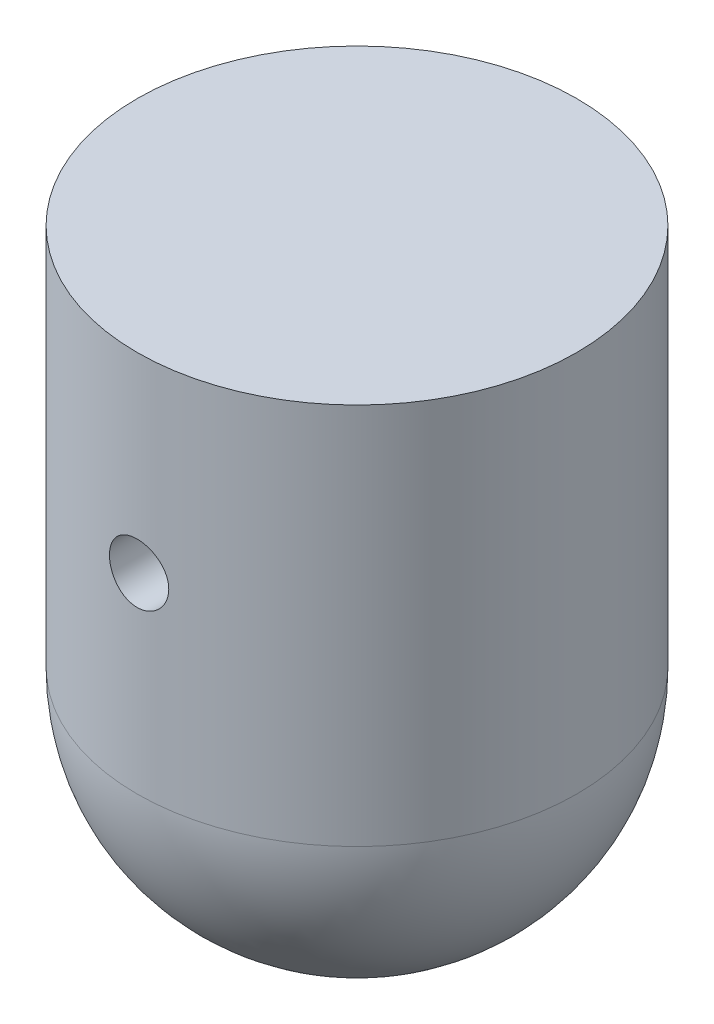
ISO-10303-21;
HEADER;
FILE_DESCRIPTION(('STEP AP214'),'2;1');
FILE_NAME('part.step','',(''),(''),'','','');
FILE_SCHEMA(('AUTOMOTIVE_DESIGN { 1 0 10303 214 1 1 1 1 }'));
ENDSEC;
DATA;
#1=APPLICATION_CONTEXT('core data for automotive mechanical design processes');
#2=APPLICATION_PROTOCOL_DEFINITION('international standard','automotive_design',2000,#1);
#3=PRODUCT_CONTEXT('',#1,'mechanical');
#4=PRODUCT('Part','Part','',(#3));
#5=PRODUCT_RELATED_PRODUCT_CATEGORY('part','',(#4));
#6=PRODUCT_DEFINITION_FORMATION('','',#4);
#7=PRODUCT_DEFINITION_CONTEXT('part definition',#1,'design');
#8=PRODUCT_DEFINITION('design','',#6,#7);
#9=PRODUCT_DEFINITION_SHAPE('','',#8);
#10=(LENGTH_UNIT() NAMED_UNIT(*) SI_UNIT(.MILLI.,.METRE.));
#11=(NAMED_UNIT(*) PLANE_ANGLE_UNIT() SI_UNIT($,.RADIAN.));
#12=(NAMED_UNIT(*) SI_UNIT($,.STERADIAN.) SOLID_ANGLE_UNIT());
#13=UNCERTAINTY_MEASURE_WITH_UNIT(LENGTH_MEASURE(1.E-05),#10,'distance_accuracy_value','');
#14=(GEOMETRIC_REPRESENTATION_CONTEXT(3) GLOBAL_UNCERTAINTY_ASSIGNED_CONTEXT((#13)) GLOBAL_UNIT_ASSIGNED_CONTEXT((#10,
#11,#12)) REPRESENTATION_CONTEXT('',''));
#15=CARTESIAN_POINT('',(0.,0.,0.));
#16=DIRECTION('',(0.,0.,1.));
#17=DIRECTION('',(1.,0.,0.));
#18=AXIS2_PLACEMENT_3D('',#15,#16,#17);
#19=CARTESIAN_POINT('',(-1.39659253553725E-13,20.,0.));
#20=DIRECTION('',(0.,-1.,0.));
#21=DIRECTION('',(1.,0.,0.));
#22=AXIS2_PLACEMENT_3D('',#19,#20,#21);
#23=CYLINDRICAL_SURFACE('',#22,11.5);
#24=CARTESIAN_POINT('',(0.,8.45000000000008,-11.5));
#25=CARTESIAN_POINT('',(0.0866428978733284,8.45000364376348,-11.4999987163886));
#26=CARTESIAN_POINT('',(0.173338510622883,8.45728933782402,-11.4990105151674));
#27=CARTESIAN_POINT('',(0.34431328457875,8.48623611754324,-11.4951634569417));
#28=CARTESIAN_POINT('',(0.428589894347276,8.50791183891256,-11.4923026954478));
#29=CARTESIAN_POINT('',(0.592227018688077,8.56498501338923,-11.4850325032003));
#30=CARTESIAN_POINT('',(0.671590948186435,8.60037280779753,-11.4806241627565));
#31=CARTESIAN_POINT('',(0.823239825609689,8.68384351941831,-11.4707479303287));
#32=CARTESIAN_POINT('',(0.895525899249772,8.73192441331432,-11.4652802072502));
#33=CARTESIAN_POINT('',(1.03144094143677,8.83974302478841,-11.4538558809928));
#34=CARTESIAN_POINT('',(1.09501837709979,8.8995454352154,-11.4478966760981));
#35=CARTESIAN_POINT('',(1.2112672848125,9.02897044809276,-11.4361817727578));
#36=CARTESIAN_POINT('',(1.26393817564616,9.09859357356246,-11.4304260851714));
#37=CARTESIAN_POINT('',(1.35707418044255,9.24602298403573,-11.4197444684231));
#38=CARTESIAN_POINT('',(1.39749040311266,9.32386041953598,-11.414821896672));
#39=CARTESIAN_POINT('',(1.46465750084194,9.48529560413313,-11.406398697008));
#40=CARTESIAN_POINT('',(1.49140897711694,9.56889309961763,-11.4028980065371));
#41=CARTESIAN_POINT('',(1.53032926283157,9.73893763528823,-11.3977400980162));
#42=CARTESIAN_POINT('',(1.54258557621056,9.82536430596658,-11.396071822506));
#43=CARTESIAN_POINT('',(1.55243850854337,9.99906259001316,-11.3947339098974));
#44=CARTESIAN_POINT('',(1.5500358098942,10.0863341638612,-11.395064179764));
#45=CARTESIAN_POINT('',(1.53071063164254,10.2586320505768,-11.3976759233191));
#46=CARTESIAN_POINT('',(1.51388493351534,10.343669443902,-11.3999443909477));
#47=CARTESIAN_POINT('',(1.46634256351911,10.5097027292705,-11.4061566365759));
#48=CARTESIAN_POINT('',(1.43562556859723,10.5906985272747,-11.4101004535369));
#49=CARTESIAN_POINT('',(1.36106977430501,10.7466478142788,-11.4192336394168));
#50=CARTESIAN_POINT('',(1.31718931262422,10.8215811450518,-11.4244269524973));
#51=CARTESIAN_POINT('',(1.21758194301051,10.9630573846504,-11.4354710062963));
#52=CARTESIAN_POINT('',(1.16185440573773,11.0295998474373,-11.4413217819327));
#53=CARTESIAN_POINT('',(1.03960031089619,11.1529669001635,-11.4530792198419));
#54=CARTESIAN_POINT('',(0.972990409387542,11.2097089239264,-11.4589859527679));
#55=CARTESIAN_POINT('',(0.831148278955995,11.3112201891634,-11.4701458144019));
#56=CARTESIAN_POINT('',(0.755916024239376,11.3559893948195,-11.4753989411546));
#57=CARTESIAN_POINT('',(0.59889816197262,11.4322857927703,-11.4846637442058));
#58=CARTESIAN_POINT('',(0.517109793734829,11.4638073714254,-11.4886748940314));
#59=CARTESIAN_POINT('',(0.349334656100912,11.5126458896649,-11.4949991816484));
#60=CARTESIAN_POINT('',(0.263348115725707,11.5299636031908,-11.4973124119555));
#61=CARTESIAN_POINT('',(0.0903308960810672,11.5497947657113,-11.4999681148013));
#62=CARTESIAN_POINT('',(0.0033134670491234,11.5524218684346,-11.5003257165596));
#63=CARTESIAN_POINT('',(-0.169920500301108,11.5430978127317,-11.4990708428393));
#64=CARTESIAN_POINT('',(-0.256137058467362,11.5311470165657,-11.497458416316));
#65=CARTESIAN_POINT('',(-0.424983258846822,11.4931008601108,-11.492454049421));
#66=CARTESIAN_POINT('',(-0.507625431821477,11.4670601290534,-11.4890689835139));
#67=CARTESIAN_POINT('',(-0.667370163569481,11.4016303998939,-11.4808980463446));
#68=CARTESIAN_POINT('',(-0.744472506704762,11.3622408825307,-11.4761121205906));
#69=CARTESIAN_POINT('',(-0.891453629458274,11.2709598202343,-11.4656346733335));
#70=CARTESIAN_POINT('',(-0.961286698924614,11.2189952822319,-11.4599379329346));
#71=CARTESIAN_POINT('',(-1.09128085643535,11.1041419136188,-11.4482912966458));
#72=CARTESIAN_POINT('',(-1.15144149511864,11.0412525757468,-11.4423413890106));
#73=CARTESIAN_POINT('',(-1.26079012857458,10.9058321471959,-11.4308118444198));
#74=CARTESIAN_POINT('',(-1.30990246360183,10.8332396966426,-11.4252349340754));
#75=CARTESIAN_POINT('',(-1.39523649918246,10.6807692835329,-11.4151289684536));
#76=CARTESIAN_POINT('',(-1.43145849278096,10.6008914866513,-11.410599889356));
#77=CARTESIAN_POINT('',(-1.4898630662442,10.4363550698906,-11.4031214274329));
#78=CARTESIAN_POINT('',(-1.512087248077,10.3517114389879,-11.4001673676526));
#79=CARTESIAN_POINT('',(-1.54199876847599,10.1798509784155,-11.3961603765188));
#80=CARTESIAN_POINT('',(-1.54968690301076,10.0926342899075,-11.3951073410687));
#81=CARTESIAN_POINT('',(-1.5502918786119,9.91885666086418,-11.3950249877507));
#82=CARTESIAN_POINT('',(-1.54332761195837,9.83229611811893,-11.3959793812177));
#83=CARTESIAN_POINT('',(-1.51507835798589,9.66158835849651,-11.3997691903086));
#84=CARTESIAN_POINT('',(-1.49379337735525,9.57744114049225,-11.402604605054));
#85=CARTESIAN_POINT('',(-1.4375459149424,9.41397075991725,-11.40983169534));
#86=CARTESIAN_POINT('',(-1.40259012726714,9.33464525825582,-11.4142226091092));
#87=CARTESIAN_POINT('',(-1.32000500515248,9.18296621475364,-11.4240670763154));
#88=CARTESIAN_POINT('',(-1.27237541061872,9.11061281603727,-11.4295206515599));
#89=CARTESIAN_POINT('',(-1.16535683817364,8.97432532227824,-11.4409288746495));
#90=CARTESIAN_POINT('',(-1.10587941831558,8.91046096757395,-11.446887084581));
#91=CARTESIAN_POINT('',(-0.977039485106418,8.79357543476775,-11.458602406755));
#92=CARTESIAN_POINT('',(-0.907674658071495,8.7405568016894,-11.4643594715354));
#93=CARTESIAN_POINT('',(-0.760673567838305,8.64666414803256,-11.4750523401042));
#94=CARTESIAN_POINT('',(-0.68300213833245,8.60584477935579,-11.4799844058083));
#95=CARTESIAN_POINT('',(-0.521880846184165,8.53788894812447,-11.488434282738));
#96=CARTESIAN_POINT('',(-0.438437263094482,8.51073787397727,-11.4919536033881));
#97=CARTESIAN_POINT('',(-0.295485298485994,8.4772637348094,-11.4963496279066));
#98=CARTESIAN_POINT('',(-0.23687178121749,8.46705486738808,-11.4977117161153));
#99=CARTESIAN_POINT('',(-0.118847106631597,8.45342178104791,-11.4995373383467));
#100=CARTESIAN_POINT('',(-0.0594359565736047,8.44999750042344,-11.5000008805415));
#101=CARTESIAN_POINT('',(0.,8.45000000000008,-11.5));
#102=B_SPLINE_CURVE_WITH_KNOTS('',3,(#24,#25,#26,#27,#28,#29,#30,#31,#32,#33,#34,#35,#36,#37,
#38,#39,#40,#41,#42,#43,#44,#45,#46,#47,#48,#49,#50,#51,#52,#53,#54,#55,#56,#57,#58,#59,#60,#61,
#62,#63,#64,#65,#66,#67,#68,#69,#70,#71,#72,#73,#74,#75,#76,#77,#78,#79,#80,#81,#82,#83,#84,#85,
#86,#87,#88,#89,#90,#91,#92,#93,#94,#95,#96,#97,#98,#99,#100,#101),.UNSPECIFIED.,.T.,.F.,(4,2,2,
2,2,2,2,2,2,2,2,2,2,2,2,2,2,2,2,2,2,2,2,2,2,2,2,2,2,2,2,2,2,2,2,2,2,2,4),(0.,0.259711562319687,
0.519687675806871,0.7794809956635,1.03923292869845,1.30046103112698,1.5617030509705,
1.82397401020357,2.08623342915418,2.34690143361449,2.60755730371579,2.86647768647041,
3.12540409092835,3.38515880102377,3.64492731324763,3.90678756828743,4.16864860670107,
4.4306204962884,4.69257811057907,4.95250625936968,5.21242794908706,5.47134902210946,
5.73028016818967,5.99075196518859,6.25123585967367,6.51345266258869,6.7756635039656,
7.03709132229067,7.29850482487021,7.55780535390551,7.81710576183775,8.07627935825663,
8.33545827389749,8.59664976490172,8.85790247616549,9.12030861786777,9.38243364496977,
9.5605941856757,9.73875310600911),.UNSPECIFIED.);
#103=CARTESIAN_POINT('',(0.,8.45000000000008,-11.5));
#104=VERTEX_POINT('',#103);
#105=EDGE_CURVE('E10',#104,#104,#102,.T.);
#106=ORIENTED_EDGE('',*,*,#105,.T.);
#107=EDGE_LOOP('',(#106));
#108=FACE_BOUND('',#107,.T.);
#109=CARTESIAN_POINT('',(1.55,10.0000000000001,11.3950647211852));
#110=CARTESIAN_POINT('',(1.54999635272623,9.91336113191974,11.3950660490933));
#111=CARTESIAN_POINT('',(1.5427113134957,9.8266695375021,11.3960634970969));
#112=CARTESIAN_POINT('',(1.51376737096541,9.65570311143409,11.3999435679442));
#113=CARTESIAN_POINT('',(1.49209381762945,9.57143083440271,11.4028281121399));
#114=CARTESIAN_POINT('',(1.43502698420188,9.40780287560253,11.410149856961));
#115=CARTESIAN_POINT('',(1.39964346551608,9.3284437422277,11.4145859526737));
#116=CARTESIAN_POINT('',(1.3161828257894,9.17680291520954,11.424509641484));
#117=CARTESIAN_POINT('',(1.26810771772358,9.10452010170234,11.4299970677954));
#118=CARTESIAN_POINT('',(1.16029497533588,8.9686014366372,11.4414449584631));
#119=CARTESIAN_POINT('',(1.10049135334953,8.90501813681631,11.4474079804517));
#120=CARTESIAN_POINT('',(0.97106144733606,8.78875789443811,11.4591122484821));
#121=CARTESIAN_POINT('',(0.901434656375081,8.73608151508907,11.4648534830591));
#122=CARTESIAN_POINT('',(0.75400197632626,8.64293972448258,11.4754937150761));
#123=CARTESIAN_POINT('',(0.676165567365666,8.60252220924572,11.4803893775669));
#124=CARTESIAN_POINT('',(0.514732611993868,8.53535243946901,11.4887586590632));
#125=CARTESIAN_POINT('',(0.43113631290841,8.50859959859187,11.4922323390831));
#126=CARTESIAN_POINT('',(0.261095676681304,8.46967652990423,11.4973482396015));
#127=CARTESIAN_POINT('',(0.174671738579055,8.45741865564424,11.4990014635909));
#128=CARTESIAN_POINT('',(0.000978822372901293,8.44756165451604,11.5003278066436));
#129=CARTESIAN_POINT('',(-0.0862901172173021,8.44996186266864,11.5000010155323));
#130=CARTESIAN_POINT('',(-0.258598861340663,8.46928305100606,11.4974130100501));
#131=CARTESIAN_POINT('',(-0.343649452041199,8.48610975851484,11.4951643547606));
#132=CARTESIAN_POINT('',(-0.509708609180633,8.53365870360604,11.4889993241823));
#133=CARTESIAN_POINT('',(-0.590717088365379,8.56438124100378,11.4850829129103));
#134=CARTESIAN_POINT('',(-0.746681929138028,8.63894860655327,11.4760007716346));
#135=CARTESIAN_POINT('',(-0.821618750095802,8.68283381969546,11.4708312062722));
#136=CARTESIAN_POINT('',(-0.963099964431222,8.78245138173123,11.4598203133346));
#137=CARTESIAN_POINT('',(-1.02964391039511,8.83818436178962,11.4539789499784));
#138=CARTESIAN_POINT('',(-1.15300499113638,8.96044237650203,11.4422225722344));
#139=CARTESIAN_POINT('',(-1.20974065332119,9.02704962921845,11.4363073414006));
#140=CARTESIAN_POINT('',(-1.31124033678633,9.1688841725736,11.4251155113826));
#141=CARTESIAN_POINT('',(-1.3560043086656,9.24411149878114,11.4198389148339));
#142=CARTESIAN_POINT('',(-1.43229691705139,9.40112790380983,11.4105219295171));
#143=CARTESIAN_POINT('',(-1.46381834560404,9.48292052736887,11.4064822143106));
#144=CARTESIAN_POINT('',(-1.51265526527616,9.65070493246682,11.4001090447335));
#145=CARTESIAN_POINT('',(-1.52997155690737,9.73669647709167,11.397775494215));
#146=CARTESIAN_POINT('',(-1.54979734375686,9.90971621631813,11.3950967139683));
#147=CARTESIAN_POINT('',(-1.55242180442709,9.99673100716337,11.3947360466873));
#148=CARTESIAN_POINT('',(-1.54309340613775,10.1699590680578,11.396002984719));
#149=CARTESIAN_POINT('',(-1.53114090989524,10.2561723579968,11.397630540559));
#150=CARTESIAN_POINT('',(-1.49309494968722,10.4250013190543,11.4026764202886));
#151=CARTESIAN_POINT('',(-1.46705774796646,10.5076299004581,11.4060876175115));
#152=CARTESIAN_POINT('',(-1.40163961668558,10.6673490057789,11.4143106138742));
#153=CARTESIAN_POINT('',(-1.36225814683559,10.7444393053058,11.4191224697234));
#154=CARTESIAN_POINT('',(-1.27098910288166,10.8914119106355,11.4296413678127));
#155=CARTESIAN_POINT('',(-1.21902649591877,10.9612472361374,11.4353537063173));
#156=CARTESIAN_POINT('',(-1.10417561756745,11.091246841796,11.4470135650924));
#157=CARTESIAN_POINT('',(-1.0412868504138,11.1514106828788,11.4529610960251));
#158=CARTESIAN_POINT('',(-0.905865091262139,11.2607666824062,11.4644689387942));
#159=CARTESIAN_POINT('',(-0.833270624475567,11.3098830557602,11.470026406159));
#160=CARTESIAN_POINT('',(-0.680795059345669,11.3952241704143,11.4800848159658));
#161=CARTESIAN_POINT('',(-0.600914127979384,11.4314492070398,11.4845857826103));
#162=CARTESIAN_POINT('',(-0.436379329578041,11.4898556995944,11.492011493375));
#163=CARTESIAN_POINT('',(-0.351740924420112,11.5120800751702,11.494941050578));
#164=CARTESIAN_POINT('',(-0.179891521170143,11.5419937521775,11.4989139316491));
#165=CARTESIAN_POINT('',(-0.0926806591936209,11.5496838212615,11.4999573551361));
#166=CARTESIAN_POINT('',(0.0810999457663516,11.5502946232098,11.5000397393278));
#167=CARTESIAN_POINT('',(0.167669294632002,11.5433318736865,11.4990945135701));
#168=CARTESIAN_POINT('',(0.338395055461715,11.5150825641499,11.4953373966527));
#169=CARTESIAN_POINT('',(0.422551471130933,11.4937960261326,11.4925255083595));
#170=CARTESIAN_POINT('',(0.586040949842423,11.4375417792893,11.4853495309952));
#171=CARTESIAN_POINT('',(0.665376288939011,11.4025805852311,11.4809861811486));
#172=CARTESIAN_POINT('',(0.817072764379746,11.319981591165,11.4711889839129));
#173=CARTESIAN_POINT('',(0.889433763718175,11.272343542199,11.4657551155006));
#174=CARTESIAN_POINT('',(1.02572133610882,11.1653154526721,11.4543710039359));
#175=CARTESIAN_POINT('',(1.08957968761126,11.1058389175614,11.4484171529104));
#176=CARTESIAN_POINT('',(1.20645352017496,10.9770032533095,11.4366922310034));
#177=CARTESIAN_POINT('',(1.25946644020434,10.9076417964959,11.4309212035651));
#178=CARTESIAN_POINT('',(1.35335268726105,10.7606436650695,11.4201876604833));
#179=CARTESIAN_POINT('',(1.39417040179939,10.6829712106382,11.4152288939235));
#180=CARTESIAN_POINT('',(1.46212285978653,10.5218477922881,11.4067252038896));
#181=CARTESIAN_POINT('',(1.48927223392189,10.4384031163232,11.4031787694988));
#182=CARTESIAN_POINT('',(1.52274176670819,10.2954556602396,11.3987470696035));
#183=CARTESIAN_POINT('',(1.5329485624663,10.2368480665962,11.3973732281358));
#184=CARTESIAN_POINT('',(1.54657889814034,10.1188352467197,11.3955316027473));
#185=CARTESIAN_POINT('',(1.55000250185151,10.0594300279934,11.3950638103052));
#186=CARTESIAN_POINT('',(1.55,10.0000000000001,11.3950647211852));
#187=B_SPLINE_CURVE_WITH_KNOTS('',3,(#109,#110,#111,#112,#113,#114,#115,#116,#117,#118,#119,
#120,#121,#122,#123,#124,#125,#126,#127,#128,#129,#130,#131,#132,#133,#134,#135,#136,#137,#138,
#139,#140,#141,#142,#143,#144,#145,#146,#147,#148,#149,#150,#151,#152,#153,#154,#155,#156,#157,
#158,#159,#160,#161,#162,#163,#164,#165,#166,#167,#168,#169,#170,#171,#172,#173,#174,#175,#176,
#177,#178,#179,#180,#181,#182,#183,#184,#185,#186),.UNSPECIFIED.,.T.,.F.,(4,2,2,2,2,2,2,2,2,2,2,
2,2,2,2,2,2,2,2,2,2,2,2,2,2,2,2,2,2,2,2,2,2,2,2,2,2,2,4),(0.,0.259699455485353,
0.519663737030214,0.779443264818907,1.03918161448199,1.3004255638344,1.56168299986087,
1.82394840976763,2.08620256518673,2.34686270981205,2.6075110294059,2.86646896354139,
3.12543248519917,3.38519881645652,3.64497898968697,3.90682293867736,4.16866796814772,
4.43065533653198,4.6926279399492,4.95254767800141,5.212460948627,5.47134356454541,
5.73023666349443,5.99071355326302,6.25120226503671,6.51342682906433,6.77564538544773,
7.03705613671561,7.29845308077178,7.55777928205016,7.81710508510145,8.07630749246473,
8.33551499062924,8.596690843702,8.85792829963356,9.12033947729905,9.38246916781029,
9.5606119737824,9.73875310433177),.UNSPECIFIED.);
#188=CARTESIAN_POINT('',(1.55,10.0000000000001,11.3950647211852));
#189=VERTEX_POINT('',#188);
#190=EDGE_CURVE('E44',#189,#189,#187,.T.);
#191=ORIENTED_EDGE('',*,*,#190,.T.);
#192=EDGE_LOOP('',(#191));
#193=FACE_BOUND('',#192,.T.);
#194=CARTESIAN_POINT('',(-1.39659253553725E-13,20.,0.));
#195=DIRECTION('',(0.,1.,0.));
#196=DIRECTION('',(-1.,0.,0.));
#197=AXIS2_PLACEMENT_3D('',#194,#195,#196);
#198=CIRCLE('',#197,11.5);
#199=CARTESIAN_POINT('',(-11.5000000000001,19.9999999999999,0.));
#200=VERTEX_POINT('',#199);
#201=EDGE_CURVE('E48',#200,#200,#198,.T.);
#202=ORIENTED_EDGE('',*,*,#201,.F.);
#203=EDGE_LOOP('',(#202));
#204=FACE_BOUND('',#203,.T.);
#205=CARTESIAN_POINT('',(0.,0.,0.));
#206=DIRECTION('',(0.,1.,0.));
#207=DIRECTION('',(-1.,0.,0.));
#208=AXIS2_PLACEMENT_3D('',#205,#206,#207);
#209=CIRCLE('',#208,11.5);
#210=CARTESIAN_POINT('',(-11.5,0.,0.));
#211=VERTEX_POINT('',#210);
#212=EDGE_CURVE('E52',#211,#211,#209,.T.);
#213=ORIENTED_EDGE('',*,*,#212,.T.);
#214=EDGE_LOOP('',(#213));
#215=FACE_BOUND('',#214,.T.);
#216=ADVANCED_FACE('F33',(#108,#193,#204,#215),#23,.T.);
#217=CARTESIAN_POINT('',(-1.39659253553725E-13,20.,0.));
#218=DIRECTION('',(0.,1.,0.));
#219=DIRECTION('',(-1.,0.,0.));
#220=AXIS2_PLACEMENT_3D('',#217,#218,#219);
#221=PLANE('',#220);
#222=ORIENTED_EDGE('',*,*,#201,.T.);
#223=EDGE_LOOP('',(#222));
#224=FACE_BOUND('',#223,.T.);
#225=ADVANCED_FACE('F64',(#224),#221,.T.);
#226=CARTESIAN_POINT('',(0.,0.,0.));
#227=DIRECTION('',(0.,0.,-1.));
#228=DIRECTION('',(-1.,0.,0.));
#229=AXIS2_PLACEMENT_3D('',#226,#227,#228);
#230=SPHERICAL_SURFACE('',#229,11.5);
#231=CARTESIAN_POINT('',(0.,0.,0.));
#232=DIRECTION('',(0.,1.,0.));
#233=DIRECTION('',(-1.,0.,0.));
#234=AXIS2_PLACEMENT_3D('',#231,#232,#233);
#235=SPHERICAL_SURFACE('',#234,11.5);
#236=ORIENTED_EDGE('',*,*,#212,.F.);
#237=EDGE_LOOP('',(#236));
#238=FACE_BOUND('',#237,.T.);
#239=ADVANCED_FACE('F35',(#238),#235,.T.);
#240=CARTESIAN_POINT('',(0.,10.0000000000001,-11.5));
#241=DIRECTION('',(0.,0.,1.));
#242=DIRECTION('',(1.,0.,0.));
#243=AXIS2_PLACEMENT_3D('',#240,#241,#242);
#244=CYLINDRICAL_SURFACE('',#243,1.55);
#245=ORIENTED_EDGE('',*,*,#190,.F.);
#246=EDGE_LOOP('',(#245));
#247=FACE_BOUND('',#246,.T.);
#248=ORIENTED_EDGE('',*,*,#105,.F.);
#249=EDGE_LOOP('',(#248));
#250=FACE_BOUND('',#249,.T.);
#251=ADVANCED_FACE('F60',(#247,#250),#244,.F.);
#252=CLOSED_SHELL('',(#216,#225,#239,#251));
#253=MANIFOLD_SOLID_BREP('B2',#252);
#254=ADVANCED_BREP_SHAPE_REPRESENTATION('',(#18,#253),#14);
#255=SHAPE_DEFINITION_REPRESENTATION(#9,#254);
ENDSEC;
END-ISO-10303-21;
